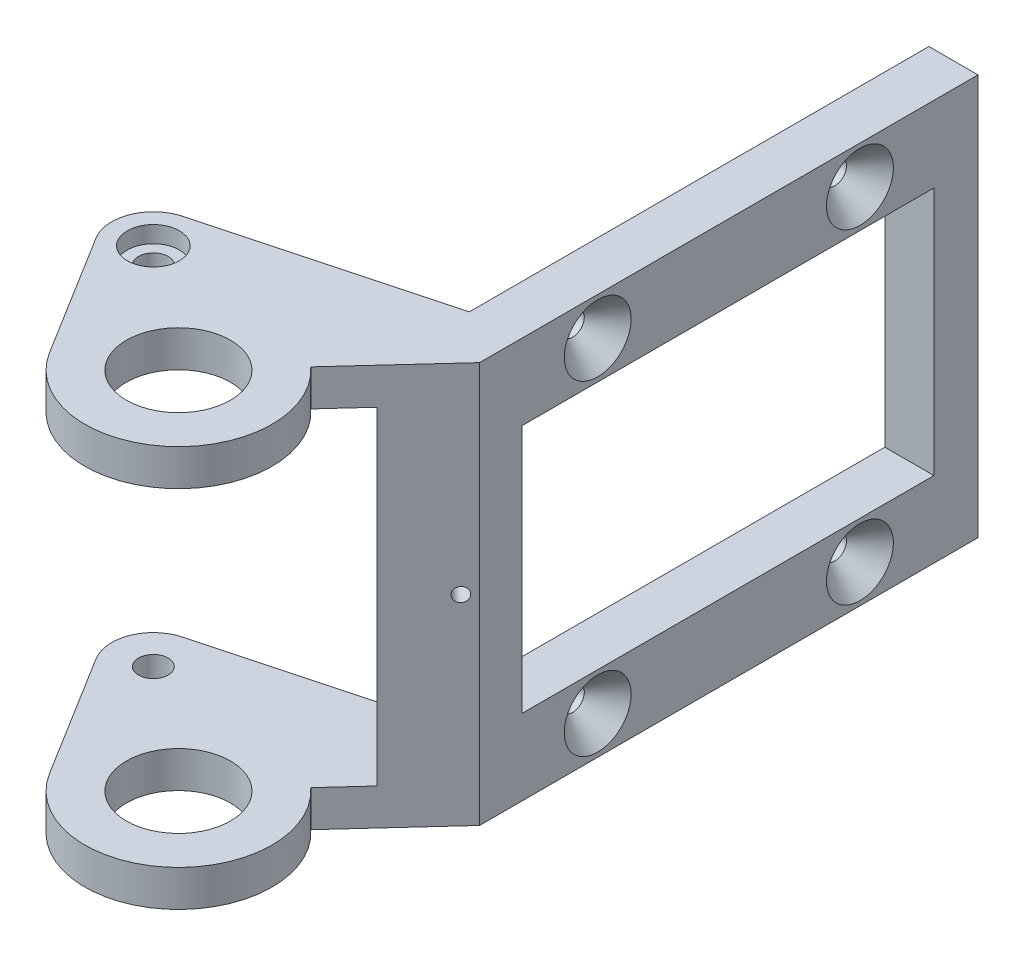
ISO-10303-21;
HEADER;
FILE_DESCRIPTION(('STEP AP214'),'2;1');
FILE_NAME('part.step','',(''),(''),'','','');
FILE_SCHEMA(('AUTOMOTIVE_DESIGN { 1 0 10303 214 1 1 1 1 }'));
ENDSEC;
DATA;
#1=APPLICATION_CONTEXT('core data for automotive mechanical design processes');
#2=APPLICATION_PROTOCOL_DEFINITION('international standard','automotive_design',2000,#1);
#3=PRODUCT_CONTEXT('',#1,'mechanical');
#4=PRODUCT('Part','Part','',(#3));
#5=PRODUCT_RELATED_PRODUCT_CATEGORY('part','',(#4));
#6=PRODUCT_DEFINITION_FORMATION('','',#4);
#7=PRODUCT_DEFINITION_CONTEXT('part definition',#1,'design');
#8=PRODUCT_DEFINITION('design','',#6,#7);
#9=PRODUCT_DEFINITION_SHAPE('','',#8);
#10=(LENGTH_UNIT() NAMED_UNIT(*) SI_UNIT(.MILLI.,.METRE.));
#11=(NAMED_UNIT(*) PLANE_ANGLE_UNIT() SI_UNIT($,.RADIAN.));
#12=(NAMED_UNIT(*) SI_UNIT($,.STERADIAN.) SOLID_ANGLE_UNIT());
#13=UNCERTAINTY_MEASURE_WITH_UNIT(LENGTH_MEASURE(1.E-05),#10,'distance_accuracy_value','');
#14=(GEOMETRIC_REPRESENTATION_CONTEXT(3) GLOBAL_UNCERTAINTY_ASSIGNED_CONTEXT((#13)) GLOBAL_UNIT_ASSIGNED_CONTEXT((#10,
#11,#12)) REPRESENTATION_CONTEXT('',''));
#15=CARTESIAN_POINT('',(0.,0.,0.));
#16=DIRECTION('',(0.,0.,1.));
#17=DIRECTION('',(1.,0.,0.));
#18=AXIS2_PLACEMENT_3D('',#15,#16,#17);
#19=CARTESIAN_POINT('',(-31.1453551016939,12.508000003,-7.26238793210637));
#20=DIRECTION('',(0.,1.,0.));
#21=DIRECTION('',(0.,0.,1.));
#22=AXIS2_PLACEMENT_3D('',#19,#20,#21);
#23=CYLINDRICAL_SURFACE('',#22,1.1303);
#24=CARTESIAN_POINT('',(-31.1453551016939,12.508000003,-7.26238793210637));
#25=DIRECTION('',(0.,-1.,0.));
#26=DIRECTION('',(0.,0.,1.));
#27=AXIS2_PLACEMENT_3D('',#24,#25,#26);
#28=CIRCLE('',#27,1.1303);
#29=CARTESIAN_POINT('',(-31.1453551016939,12.508000003,-6.13208793210637));
#30=VERTEX_POINT('',#29);
#31=EDGE_CURVE('E297',#30,#30,#28,.T.);
#32=ORIENTED_EDGE('',*,*,#31,.T.);
#33=EDGE_LOOP('',(#32));
#34=FACE_BOUND('',#33,.T.);
#35=CARTESIAN_POINT('',(-31.1453551016939,14.016125003,-7.26238793210637));
#36=DIRECTION('',(0.,-1.,0.));
#37=DIRECTION('',(0.,0.,1.));
#38=AXIS2_PLACEMENT_3D('',#35,#36,#37);
#39=CIRCLE('',#38,1.1303);
#40=CARTESIAN_POINT('',(-31.1453551016939,14.016125003,-6.13208793210637));
#41=VERTEX_POINT('',#40);
#42=EDGE_CURVE('E38',#41,#41,#39,.F.);
#43=ORIENTED_EDGE('',*,*,#42,.T.);
#44=EDGE_LOOP('',(#43));
#45=FACE_BOUND('',#44,.T.);
#46=ADVANCED_FACE('F34',(#34,#45),#23,.F.);
#47=CARTESIAN_POINT('',(-21.968,15.286125003,0.));
#48=DIRECTION('',(0.,-1.,0.));
#49=DIRECTION('',(0.,0.,-1.));
#50=AXIS2_PLACEMENT_3D('',#47,#48,#49);
#51=CYLINDRICAL_SURFACE('',#50,7.14375);
#52=DIRECTION('',(0.,-1.,0.));
#53=VECTOR('',#52,1.);
#54=CARTESIAN_POINT('',(-28.038032359184,-12.508000003,3.76667907060839));
#55=LINE('',#54,#53);
#56=CARTESIAN_POINT('',(-28.038032359184,-12.508000003,3.76667907060839));
#57=VERTEX_POINT('',#56);
#58=CARTESIAN_POINT('',(-28.038032359184,-15.286125003,3.76667907060839));
#59=VERTEX_POINT('',#58);
#60=EDGE_CURVE('E398',#57,#59,#55,.T.);
#61=ORIENTED_EDGE('',*,*,#60,.T.);
#62=CARTESIAN_POINT('',(-21.968,-15.286125003,0.));
#63=DIRECTION('',(0.,-1.,0.));
#64=DIRECTION('',(0.,0.,1.));
#65=AXIS2_PLACEMENT_3D('',#62,#63,#64);
#66=CIRCLE('',#65,7.14375);
#67=CARTESIAN_POINT('',(-17.1417524543456,-15.286125003,-5.26692497483732));
#68=VERTEX_POINT('',#67);
#69=EDGE_CURVE('E206',#68,#59,#66,.T.);
#70=ORIENTED_EDGE('',*,*,#69,.F.);
#71=DIRECTION('',(0.,-1.,0.));
#72=VECTOR('',#71,1.);
#73=CARTESIAN_POINT('',(-17.1417524543456,15.286125003,-5.26692497483732));
#74=LINE('',#73,#72);
#75=CARTESIAN_POINT('',(-17.1417524543456,-12.508000003,-5.26692497483732));
#76=VERTEX_POINT('',#75);
#77=EDGE_CURVE('E210',#76,#68,#74,.T.);
#78=ORIENTED_EDGE('',*,*,#77,.F.);
#79=CARTESIAN_POINT('',(-21.968,-12.508000003,0.));
#80=DIRECTION('',(0.,1.,0.));
#81=DIRECTION('',(-1.,0.,0.));
#82=AXIS2_PLACEMENT_3D('',#79,#80,#81);
#83=CIRCLE('',#82,7.14375);
#84=EDGE_CURVE('E229',#57,#76,#83,.T.);
#85=ORIENTED_EDGE('',*,*,#84,.F.);
#86=EDGE_LOOP('',(#61,#70,#78,#85));
#87=FACE_BOUND('',#86,.T.);
#88=ADVANCED_FACE('F429',(#87),#51,.T.);
#89=DIRECTION('',(0.,1.,0.));
#90=VECTOR('',#89,1.);
#91=CARTESIAN_POINT('',(-28.038032359184,12.508000003,3.76667907060839));
#92=LINE('',#91,#90);
#93=CARTESIAN_POINT('',(-28.038032359184,12.508000003,3.76667907060839));
#94=VERTEX_POINT('',#93);
#95=CARTESIAN_POINT('',(-28.038032359184,15.286125003,3.76667907060839));
#96=VERTEX_POINT('',#95);
#97=EDGE_CURVE('E301',#94,#96,#92,.T.);
#98=ORIENTED_EDGE('',*,*,#97,.F.);
#99=CARTESIAN_POINT('',(-21.968,12.508000003,0.));
#100=DIRECTION('',(0.,-1.,0.));
#101=DIRECTION('',(1.,0.,0.));
#102=AXIS2_PLACEMENT_3D('',#99,#100,#101);
#103=CIRCLE('',#102,7.14375);
#104=CARTESIAN_POINT('',(-17.1417524543456,12.508000003,-5.26692497483732));
#105=VERTEX_POINT('',#104);
#106=EDGE_CURVE('E223',#105,#94,#103,.T.);
#107=ORIENTED_EDGE('',*,*,#106,.F.);
#108=CARTESIAN_POINT('',(-17.1417524543456,15.286125003,-5.26692497483732));
#109=VERTEX_POINT('',#108);
#110=EDGE_CURVE('E213',#109,#105,#74,.T.);
#111=ORIENTED_EDGE('',*,*,#110,.F.);
#112=CARTESIAN_POINT('',(-21.968,15.286125003,0.));
#113=DIRECTION('',(0.,-1.,0.));
#114=DIRECTION('',(0.,0.,1.));
#115=AXIS2_PLACEMENT_3D('',#112,#113,#114);
#116=CIRCLE('',#115,7.14375);
#117=EDGE_CURVE('E207',#109,#96,#116,.T.);
#118=ORIENTED_EDGE('',*,*,#117,.T.);
#119=EDGE_LOOP('',(#98,#107,#111,#118));
#120=FACE_BOUND('',#119,.T.);
#121=ADVANCED_FACE('F413',(#120),#51,.T.);
#122=CARTESIAN_POINT('',(-40.4562897388681,0.,-37.6196073422551));
#123=DIRECTION('',(0.737277336810123,0.,0.675590207615661));
#124=DIRECTION('',(-0.675590207615662,0.,0.737277336810123));
#125=AXIS2_PLACEMENT_3D('',#122,#123,#124);
#126=CYLINDRICAL_SURFACE('',#125,0.535);
#127=CARTESIAN_POINT('',(-11.6682378679477,0.,-11.2402179737));
#128=DIRECTION('',(-0.737277336810123,0.,-0.675590207615662));
#129=DIRECTION('',(-0.675590207615662,0.,0.737277336810123));
#130=AXIS2_PLACEMENT_3D('',#127,#128,#129);
#131=CIRCLE('',#130,0.535);
#132=CARTESIAN_POINT('',(-12.0296786290221,0.,-10.8457745985066));
#133=VERTEX_POINT('',#132);
#134=EDGE_CURVE('E246',#133,#133,#131,.T.);
#135=ORIENTED_EDGE('',*,*,#134,.F.);
#136=EDGE_LOOP('',(#135));
#137=FACE_BOUND('',#136,.T.);
#138=CARTESIAN_POINT('',(-13.1427925415679,0.,-12.5913983889314));
#139=DIRECTION('',(0.737277336810123,0.,0.675590207615662));
#140=DIRECTION('',(0.675590207615662,0.,-0.737277336810123));
#141=AXIS2_PLACEMENT_3D('',#138,#139,#140);
#142=CIRCLE('',#141,0.535);
#143=CARTESIAN_POINT('',(-12.7813517804935,0.,-12.9858417641248));
#144=VERTEX_POINT('',#143);
#145=EDGE_CURVE('E239',#144,#144,#142,.F.);
#146=ORIENTED_EDGE('',*,*,#145,.T.);
#147=EDGE_LOOP('',(#146));
#148=FACE_BOUND('',#147,.T.);
#149=ADVANCED_FACE('F482',(#137,#148),#126,.F.);
#150=CARTESIAN_POINT('',(-21.968,15.286125003,0.));
#151=DIRECTION('',(-0.737277336810123,0.,-0.675590207615662));
#152=DIRECTION('',(0.675590207615662,0.,-0.737277336810123));
#153=AXIS2_PLACEMENT_3D('',#150,#151,#152);
#154=PLANE('',#153);
#155=ORIENTED_EDGE('',*,*,#134,.T.);
#156=EDGE_LOOP('',(#155));
#157=FACE_BOUND('',#156,.T.);
#158=DIRECTION('',(0.,1.,0.));
#159=VECTOR('',#158,1.);
#160=CARTESIAN_POINT('',(-10.984,15.286125003,-11.9869325757448));
#161=LINE('',#160,#159);
#162=CARTESIAN_POINT('',(-10.984,-15.286125003,-11.9869325757448));
#163=VERTEX_POINT('',#162);
#164=CARTESIAN_POINT('',(-10.984,15.286125003,-11.9869325757448));
#165=VERTEX_POINT('',#164);
#166=EDGE_CURVE('E360',#163,#165,#161,.T.);
#167=ORIENTED_EDGE('',*,*,#166,.T.);
#168=DIRECTION('',(-0.675590207615662,0.,0.737277336810123));
#169=VECTOR('',#168,1.);
#170=CARTESIAN_POINT('',(-21.968,15.286125003,0.));
#171=LINE('',#170,#169);
#172=EDGE_CURVE('E220',#165,#109,#171,.T.);
#173=ORIENTED_EDGE('',*,*,#172,.T.);
#174=ORIENTED_EDGE('',*,*,#110,.T.);
#175=DIRECTION('',(-0.675590207615662,0.,0.737277336810123));
#176=VECTOR('',#175,1.);
#177=CARTESIAN_POINT('',(-21.968,12.508000003,0.));
#178=LINE('',#177,#176);
#179=CARTESIAN_POINT('',(-14.7305,12.508000003,-7.89834527648882));
#180=VERTEX_POINT('',#179);
#181=EDGE_CURVE('E193',#180,#105,#178,.T.);
#182=ORIENTED_EDGE('',*,*,#181,.F.);
#183=DIRECTION('',(0.,1.,0.));
#184=VECTOR('',#183,1.);
#185=CARTESIAN_POINT('',(-14.7305,15.286125003,-7.89834527648882));
#186=LINE('',#185,#184);
#187=CARTESIAN_POINT('',(-14.7305,-12.508000003,-7.89834527648883));
#188=VERTEX_POINT('',#187);
#189=EDGE_CURVE('E204',#188,#180,#186,.T.);
#190=ORIENTED_EDGE('',*,*,#189,.F.);
#191=DIRECTION('',(0.675590207615662,0.,-0.737277336810123));
#192=VECTOR('',#191,1.);
#193=CARTESIAN_POINT('',(-21.968,-12.508000003,0.));
#194=LINE('',#193,#192);
#195=EDGE_CURVE('E191',#76,#188,#194,.T.);
#196=ORIENTED_EDGE('',*,*,#195,.F.);
#197=ORIENTED_EDGE('',*,*,#77,.T.);
#198=DIRECTION('',(-0.675590207615662,0.,0.737277336810123));
#199=VECTOR('',#198,1.);
#200=CARTESIAN_POINT('',(-21.968,-15.286125003,0.));
#201=LINE('',#200,#199);
#202=EDGE_CURVE('E221',#163,#68,#201,.T.);
#203=ORIENTED_EDGE('',*,*,#202,.F.);
#204=EDGE_LOOP('',(#167,#173,#174,#182,#190,#196,#197,#203));
#205=FACE_BOUND('',#204,.T.);
#206=ADVANCED_FACE('F408',(#157,#205),#154,.F.);
#207=CARTESIAN_POINT('',(-9.96800000000001,15.286125003,-50.));
#208=DIRECTION('',(0.,0.,1.));
#209=DIRECTION('',(-1.,0.,0.));
#210=AXIS2_PLACEMENT_3D('',#207,#208,#209);
#211=PLANE('',#210);
#212=DIRECTION('',(0.,-1.,0.));
#213=VECTOR('',#212,1.);
#214=CARTESIAN_POINT('',(-10.984,15.286125003,-50.));
#215=LINE('',#214,#213);
#216=CARTESIAN_POINT('',(-10.984,15.286125003,-50.));
#217=VERTEX_POINT('',#216);
#218=CARTESIAN_POINT('',(-10.984,-15.286125003,-50.));
#219=VERTEX_POINT('',#218);
#220=EDGE_CURVE('E357',#217,#219,#215,.T.);
#221=ORIENTED_EDGE('',*,*,#220,.T.);
#222=DIRECTION('',(1.,0.,0.));
#223=VECTOR('',#222,1.);
#224=CARTESIAN_POINT('',(-9.96800000000001,-15.286125003,-50.));
#225=LINE('',#224,#223);
#226=CARTESIAN_POINT('',(-14.7305,-15.286125003,-50.));
#227=VERTEX_POINT('',#226);
#228=EDGE_CURVE('E216',#227,#219,#225,.T.);
#229=ORIENTED_EDGE('',*,*,#228,.F.);
#230=DIRECTION('',(0.,1.,0.));
#231=VECTOR('',#230,1.);
#232=CARTESIAN_POINT('',(-14.7305,12.508000003,-50.));
#233=LINE('',#232,#231);
#234=CARTESIAN_POINT('',(-14.7305,15.286125003,-50.));
#235=VERTEX_POINT('',#234);
#236=EDGE_CURVE('E198',#227,#235,#233,.T.);
#237=ORIENTED_EDGE('',*,*,#236,.T.);
#238=DIRECTION('',(1.,0.,0.));
#239=VECTOR('',#238,1.);
#240=CARTESIAN_POINT('',(-9.96800000000001,15.286125003,-50.));
#241=LINE('',#240,#239);
#242=EDGE_CURVE('E217',#235,#217,#241,.T.);
#243=ORIENTED_EDGE('',*,*,#242,.T.);
#244=EDGE_LOOP('',(#221,#229,#237,#243));
#245=FACE_BOUND('',#244,.T.);
#246=ADVANCED_FACE('F376',(#245),#211,.F.);
#247=CARTESIAN_POINT('',(-21.968,15.286125003,0.));
#248=DIRECTION('',(0.,-1.,0.));
#249=DIRECTION('',(0.,0.,-1.));
#250=AXIS2_PLACEMENT_3D('',#247,#248,#249);
#251=PLANE('',#250);
#252=CARTESIAN_POINT('',(-31.1453551016939,15.286125003,-7.26238793210637));
#253=DIRECTION('',(0.,-1.,0.));
#254=DIRECTION('',(0.,0.,1.));
#255=AXIS2_PLACEMENT_3D('',#252,#253,#254);
#256=CIRCLE('',#255,1.984375);
#257=CARTESIAN_POINT('',(-31.1453551016939,15.286125003,-5.27801293210637));
#258=VERTEX_POINT('',#257);
#259=EDGE_CURVE('E464',#258,#258,#256,.T.);
#260=ORIENTED_EDGE('',*,*,#259,.T.);
#261=EDGE_LOOP('',(#260));
#262=FACE_BOUND('',#261,.T.);
#263=DIRECTION('',(-0.52726916124002,0.,-0.849698317996009));
#264=VECTOR('',#263,1.);
#265=CARTESIAN_POINT('',(-28.038032359184,15.286125003,3.76667907060839));
#266=LINE('',#265,#264);
#267=CARTESIAN_POINT('',(-33.8431472613312,15.286125003,-5.58830834516931));
#268=VERTEX_POINT('',#267);
#269=EDGE_CURVE('E292',#96,#268,#266,.T.);
#270=ORIENTED_EDGE('',*,*,#269,.F.);
#271=ORIENTED_EDGE('',*,*,#117,.F.);
#272=ORIENTED_EDGE('',*,*,#172,.F.);
#273=DIRECTION('',(0.,0.,-1.));
#274=VECTOR('',#273,1.);
#275=CARTESIAN_POINT('',(-10.984,15.286125003,0.));
#276=LINE('',#275,#274);
#277=EDGE_CURVE('E363',#165,#217,#276,.T.);
#278=ORIENTED_EDGE('',*,*,#277,.T.);
#279=ORIENTED_EDGE('',*,*,#242,.F.);
#280=DIRECTION('',(0.,0.,1.));
#281=VECTOR('',#280,1.);
#282=CARTESIAN_POINT('',(-14.7305,15.286125003,-50.));
#283=LINE('',#282,#281);
#284=CARTESIAN_POINT('',(-14.7305,15.286125003,-14.9477369732811));
#285=VERTEX_POINT('',#284);
#286=EDGE_CURVE('E289',#235,#285,#283,.T.);
#287=ORIENTED_EDGE('',*,*,#286,.T.);
#288=DIRECTION('',(0.965925826289069,0.,-0.258819045102518));
#289=VECTOR('',#288,1.);
#290=CARTESIAN_POINT('',(-14.7305,15.286125003,-14.9477369732811));
#291=LINE('',#290,#289);
#292=CARTESIAN_POINT('',(-31.9671055698944,15.286125003,-10.3292024305742));
#293=VERTEX_POINT('',#292);
#294=EDGE_CURVE('E285',#293,#285,#291,.T.);
#295=ORIENTED_EDGE('',*,*,#294,.F.);
#296=CARTESIAN_POINT('',(-31.1453551016939,15.286125003,-7.26238793210637));
#297=DIRECTION('',(0.,1.,0.));
#298=DIRECTION('',(0.,0.,-1.));
#299=AXIS2_PLACEMENT_3D('',#296,#297,#298);
#300=CIRCLE('',#299,3.175);
#301=EDGE_CURVE('E278',#268,#293,#300,.F.);
#302=ORIENTED_EDGE('',*,*,#301,.F.);
#303=EDGE_LOOP('',(#270,#271,#272,#278,#279,#287,#295,#302));
#304=FACE_BOUND('',#303,.T.);
#305=CARTESIAN_POINT('',(-21.968,15.286125003,0.));
#306=DIRECTION('',(0.,-1.,0.));
#307=DIRECTION('',(0.,0.,1.));
#308=AXIS2_PLACEMENT_3D('',#305,#306,#307);
#309=CIRCLE('',#308,3.96875);
#310=CARTESIAN_POINT('',(-21.968,15.286125003,3.96875));
#311=VERTEX_POINT('',#310);
#312=EDGE_CURVE('E185',#311,#311,#309,.T.);
#313=ORIENTED_EDGE('',*,*,#312,.T.);
#314=EDGE_LOOP('',(#313));
#315=FACE_BOUND('',#314,.T.);
#316=ADVANCED_FACE('F286',(#262,#304,#315),#251,.F.);
#317=CARTESIAN_POINT('',(-21.968,-15.286125003,0.));
#318=DIRECTION('',(0.,-1.,0.));
#319=DIRECTION('',(0.,0.,-1.));
#320=AXIS2_PLACEMENT_3D('',#317,#318,#319);
#321=PLANE('',#320);
#322=DIRECTION('',(0.965925826289069,0.,-0.258819045102518));
#323=VECTOR('',#322,1.);
#324=CARTESIAN_POINT('',(-14.7305,-15.286125003,-14.9477369732811));
#325=LINE('',#324,#323);
#326=CARTESIAN_POINT('',(-31.9671055698944,-15.286125003,-10.3292024305742));
#327=VERTEX_POINT('',#326);
#328=CARTESIAN_POINT('',(-14.7305,-15.286125003,-14.9477369732811));
#329=VERTEX_POINT('',#328);
#330=EDGE_CURVE('E388',#327,#329,#325,.T.);
#331=ORIENTED_EDGE('',*,*,#330,.T.);
#332=DIRECTION('',(0.,0.,1.));
#333=VECTOR('',#332,1.);
#334=CARTESIAN_POINT('',(-14.7305,-15.286125003,-50.));
#335=LINE('',#334,#333);
#336=EDGE_CURVE('E183',#227,#329,#335,.T.);
#337=ORIENTED_EDGE('',*,*,#336,.F.);
#338=ORIENTED_EDGE('',*,*,#228,.T.);
#339=DIRECTION('',(0.,0.,-1.));
#340=VECTOR('',#339,1.);
#341=CARTESIAN_POINT('',(-10.984,-15.286125003,0.));
#342=LINE('',#341,#340);
#343=EDGE_CURVE('E231',#163,#219,#342,.T.);
#344=ORIENTED_EDGE('',*,*,#343,.F.);
#345=ORIENTED_EDGE('',*,*,#202,.T.);
#346=ORIENTED_EDGE('',*,*,#69,.T.);
#347=DIRECTION('',(-0.52726916124002,0.,-0.849698317996009));
#348=VECTOR('',#347,1.);
#349=CARTESIAN_POINT('',(-28.038032359184,-15.286125003,3.76667907060839));
#350=LINE('',#349,#348);
#351=CARTESIAN_POINT('',(-33.8431472613312,-15.286125003,-5.58830834516931));
#352=VERTEX_POINT('',#351);
#353=EDGE_CURVE('E175',#59,#352,#350,.T.);
#354=ORIENTED_EDGE('',*,*,#353,.T.);
#355=CARTESIAN_POINT('',(-31.1453551016939,-15.286125003,-7.26238793210637));
#356=DIRECTION('',(0.,1.,0.));
#357=DIRECTION('',(0.,0.,-1.));
#358=AXIS2_PLACEMENT_3D('',#355,#356,#357);
#359=CIRCLE('',#358,3.175);
#360=EDGE_CURVE('E269',#327,#352,#359,.T.);
#361=ORIENTED_EDGE('',*,*,#360,.F.);
#362=EDGE_LOOP('',(#331,#337,#338,#344,#345,#346,#354,#361));
#363=FACE_BOUND('',#362,.T.);
#364=CARTESIAN_POINT('',(-31.1453551016939,-15.286125003,-7.26238793210637));
#365=DIRECTION('',(0.,-1.,0.));
#366=DIRECTION('',(0.,0.,1.));
#367=AXIS2_PLACEMENT_3D('',#364,#365,#366);
#368=CIRCLE('',#367,1.1303);
#369=CARTESIAN_POINT('',(-31.1453551016939,-15.286125003,-6.13208793210637));
#370=VERTEX_POINT('',#369);
#371=EDGE_CURVE('E394',#370,#370,#368,.T.);
#372=ORIENTED_EDGE('',*,*,#371,.F.);
#373=EDGE_LOOP('',(#372));
#374=FACE_BOUND('',#373,.T.);
#375=CARTESIAN_POINT('',(-21.968,-15.286125003,0.));
#376=DIRECTION('',(0.,-1.,0.));
#377=DIRECTION('',(0.,0.,1.));
#378=AXIS2_PLACEMENT_3D('',#375,#376,#377);
#379=CIRCLE('',#378,3.96875);
#380=CARTESIAN_POINT('',(-21.968,-15.286125003,3.96875));
#381=VERTEX_POINT('',#380);
#382=EDGE_CURVE('E236',#381,#381,#379,.T.);
#383=ORIENTED_EDGE('',*,*,#382,.F.);
#384=EDGE_LOOP('',(#383));
#385=FACE_BOUND('',#384,.T.);
#386=ADVANCED_FACE('F385',(#363,#374,#385),#321,.T.);
#387=CARTESIAN_POINT('',(-14.7305,12.508000003,7.14375));
#388=DIRECTION('',(1.,0.,0.));
#389=DIRECTION('',(0.,-1.,0.));
#390=AXIS2_PLACEMENT_3D('',#387,#388,#389);
#391=PLANE('',#390);
#392=CARTESIAN_POINT('',(-14.7305,12.3930625015,-40.9934662878724));
#393=DIRECTION('',(-1.,0.,0.));
#394=DIRECTION('',(0.,-1.,0.));
#395=AXIS2_PLACEMENT_3D('',#392,#393,#394);
#396=CIRCLE('',#395,0.888999999999997);
#397=CARTESIAN_POINT('',(-14.7305,11.5040625015,-40.9934662878724));
#398=VERTEX_POINT('',#397);
#399=EDGE_CURVE('E263',#398,#398,#396,.T.);
#400=ORIENTED_EDGE('',*,*,#399,.F.);
#401=EDGE_LOOP('',(#400));
#402=FACE_BOUND('',#401,.T.);
#403=CARTESIAN_POINT('',(-14.7305,12.3930625015,-20.9934662878724));
#404=DIRECTION('',(-1.,0.,0.));
#405=DIRECTION('',(0.,-1.,0.));
#406=AXIS2_PLACEMENT_3D('',#403,#404,#405);
#407=CIRCLE('',#406,0.888999999999997);
#408=CARTESIAN_POINT('',(-14.7305,11.5040625015,-20.9934662878724));
#409=VERTEX_POINT('',#408);
#410=EDGE_CURVE('E258',#409,#409,#407,.T.);
#411=ORIENTED_EDGE('',*,*,#410,.F.);
#412=EDGE_LOOP('',(#411));
#413=FACE_BOUND('',#412,.T.);
#414=CARTESIAN_POINT('',(-14.7305,-12.3930625015,-20.9934662878724));
#415=DIRECTION('',(-1.,0.,0.));
#416=DIRECTION('',(0.,-1.,0.));
#417=AXIS2_PLACEMENT_3D('',#414,#415,#416);
#418=CIRCLE('',#417,0.888999999999997);
#419=CARTESIAN_POINT('',(-14.7305,-13.2820625015,-20.9934662878724));
#420=VERTEX_POINT('',#419);
#421=EDGE_CURVE('E253',#420,#420,#418,.T.);
#422=ORIENTED_EDGE('',*,*,#421,.F.);
#423=EDGE_LOOP('',(#422));
#424=FACE_BOUND('',#423,.T.);
#425=CARTESIAN_POINT('',(-14.7305,-12.3930625015,-40.9934662878724));
#426=DIRECTION('',(-1.,0.,0.));
#427=DIRECTION('',(0.,-1.,0.));
#428=AXIS2_PLACEMENT_3D('',#425,#426,#427);
#429=CIRCLE('',#428,0.888999999999997);
#430=CARTESIAN_POINT('',(-14.7305,-13.2820625015,-40.9934662878724));
#431=VERTEX_POINT('',#430);
#432=EDGE_CURVE('E248',#431,#431,#429,.T.);
#433=ORIENTED_EDGE('',*,*,#432,.F.);
#434=EDGE_LOOP('',(#433));
#435=FACE_BOUND('',#434,.T.);
#436=DIRECTION('',(0.,0.,-1.));
#437=VECTOR('',#436,1.);
#438=CARTESIAN_POINT('',(-14.7305,-9.50000000000001,-15.2179446184681));
#439=LINE('',#438,#437);
#440=CARTESIAN_POINT('',(-14.7305,-9.50000000000001,-15.2179446184681));
#441=VERTEX_POINT('',#440);
#442=CARTESIAN_POINT('',(-14.7305,-9.50000000000001,-46.6399446184682));
#443=VERTEX_POINT('',#442);
#444=EDGE_CURVE('E325',#441,#443,#439,.T.);
#445=ORIENTED_EDGE('',*,*,#444,.T.);
#446=DIRECTION('',(0.,1.,0.));
#447=VECTOR('',#446,1.);
#448=CARTESIAN_POINT('',(-14.7305,-9.50000000000001,-46.6399446184682));
#449=LINE('',#448,#447);
#450=CARTESIAN_POINT('',(-14.7305,9.49999999999999,-46.6399446184682));
#451=VERTEX_POINT('',#450);
#452=EDGE_CURVE('E251',#443,#451,#449,.T.);
#453=ORIENTED_EDGE('',*,*,#452,.T.);
#454=DIRECTION('',(0.,0.,1.));
#455=VECTOR('',#454,1.);
#456=CARTESIAN_POINT('',(-14.7305,9.49999999999999,-15.2179446184681));
#457=LINE('',#456,#455);
#458=CARTESIAN_POINT('',(-14.7305,9.49999999999999,-15.2179446184681));
#459=VERTEX_POINT('',#458);
#460=EDGE_CURVE('E337',#451,#459,#457,.T.);
#461=ORIENTED_EDGE('',*,*,#460,.T.);
#462=DIRECTION('',(0.,-1.,0.));
#463=VECTOR('',#462,1.);
#464=CARTESIAN_POINT('',(-14.7305,-9.50000000000001,-15.2179446184681));
#465=LINE('',#464,#463);
#466=CARTESIAN_POINT('',(-14.7305,0.90346959405097,-15.2179446184681));
#467=VERTEX_POINT('',#466);
#468=EDGE_CURVE('E341',#459,#467,#465,.T.);
#469=ORIENTED_EDGE('',*,*,#468,.T.);
#470=CARTESIAN_POINT('',(-14.7305,0.,-14.0462642283127));
#471=DIRECTION('',(-1.,0.,0.));
#472=DIRECTION('',(0.,0.,1.));
#473=AXIS2_PLACEMENT_3D('',#470,#471,#472);
#474=ELLIPSE('',#473,1.69542713113657,1.25);
#475=CARTESIAN_POINT('',(-14.7305,-0.903469594050969,-15.2179446184681));
#476=VERTEX_POINT('',#475);
#477=EDGE_CURVE('E242',#467,#476,#474,.F.);
#478=ORIENTED_EDGE('',*,*,#477,.T.);
#479=EDGE_CURVE('E340',#476,#441,#465,.T.);
#480=ORIENTED_EDGE('',*,*,#479,.T.);
#481=EDGE_LOOP('',(#445,#453,#461,#469,#478,#480));
#482=FACE_BOUND('',#481,.T.);
#483=DIRECTION('',(0.,0.,-1.));
#484=VECTOR('',#483,1.);
#485=CARTESIAN_POINT('',(-14.7305,-12.508000003,7.14375));
#486=LINE('',#485,#484);
#487=CARTESIAN_POINT('',(-14.7305,-12.508000003,-14.9477369732811));
#488=VERTEX_POINT('',#487);
#489=EDGE_CURVE('E180',#188,#488,#486,.T.);
#490=ORIENTED_EDGE('',*,*,#489,.F.);
#491=ORIENTED_EDGE('',*,*,#189,.T.);
#492=DIRECTION('',(0.,0.,-1.));
#493=VECTOR('',#492,1.);
#494=CARTESIAN_POINT('',(-14.7305,12.508000003,7.14375));
#495=LINE('',#494,#493);
#496=CARTESIAN_POINT('',(-14.7305,12.508000003,-14.9477369732811));
#497=VERTEX_POINT('',#496);
#498=EDGE_CURVE('E194',#180,#497,#495,.T.);
#499=ORIENTED_EDGE('',*,*,#498,.T.);
#500=DIRECTION('',(0.,1.,0.));
#501=VECTOR('',#500,1.);
#502=CARTESIAN_POINT('',(-14.7305,-15.286125003,-14.9477369732811));
#503=LINE('',#502,#501);
#504=EDGE_CURVE('E186',#497,#285,#503,.T.);
#505=ORIENTED_EDGE('',*,*,#504,.T.);
#506=ORIENTED_EDGE('',*,*,#286,.F.);
#507=ORIENTED_EDGE('',*,*,#236,.F.);
#508=ORIENTED_EDGE('',*,*,#336,.T.);
#509=EDGE_CURVE('E167',#329,#488,#503,.T.);
#510=ORIENTED_EDGE('',*,*,#509,.T.);
#511=EDGE_LOOP('',(#490,#491,#499,#505,#506,#507,#508,#510));
#512=FACE_BOUND('',#511,.T.);
#513=ADVANCED_FACE('F178',(#402,#413,#424,#435,#482,#512),#391,.F.);
#514=CARTESIAN_POINT('',(-14.7305,-12.508000003,7.14375));
#515=DIRECTION('',(0.,-1.,0.));
#516=DIRECTION('',(-1.,0.,0.));
#517=AXIS2_PLACEMENT_3D('',#514,#515,#516);
#518=PLANE('',#517);
#519=DIRECTION('',(-0.52726916124002,0.,-0.849698317996009));
#520=VECTOR('',#519,1.);
#521=CARTESIAN_POINT('',(-28.038032359184,-12.508000003,3.76667907060839));
#522=LINE('',#521,#520);
#523=CARTESIAN_POINT('',(-33.8431472613312,-12.508000003,-5.58830834516931));
#524=VERTEX_POINT('',#523);
#525=EDGE_CURVE('E174',#57,#524,#522,.T.);
#526=ORIENTED_EDGE('',*,*,#525,.F.);
#527=ORIENTED_EDGE('',*,*,#84,.T.);
#528=ORIENTED_EDGE('',*,*,#195,.T.);
#529=ORIENTED_EDGE('',*,*,#489,.T.);
#530=DIRECTION('',(0.965925826289069,0.,-0.258819045102518));
#531=VECTOR('',#530,1.);
#532=CARTESIAN_POINT('',(-14.7305,-12.508000003,-14.9477369732811));
#533=LINE('',#532,#531);
#534=CARTESIAN_POINT('',(-31.9671055698944,-12.508000003,-10.3292024305742));
#535=VERTEX_POINT('',#534);
#536=EDGE_CURVE('E163',#535,#488,#533,.T.);
#537=ORIENTED_EDGE('',*,*,#536,.F.);
#538=CARTESIAN_POINT('',(-31.1453551016939,-12.508000003,-7.26238793210637));
#539=DIRECTION('',(0.,1.,0.));
#540=DIRECTION('',(-1.,0.,0.));
#541=AXIS2_PLACEMENT_3D('',#538,#539,#540);
#542=CIRCLE('',#541,3.175);
#543=EDGE_CURVE('E274',#524,#535,#542,.F.);
#544=ORIENTED_EDGE('',*,*,#543,.F.);
#545=EDGE_LOOP('',(#526,#527,#528,#529,#537,#544));
#546=FACE_BOUND('',#545,.T.);
#547=CARTESIAN_POINT('',(-31.1453551016939,-12.508000003,-7.26238793210637));
#548=DIRECTION('',(0.,-1.,0.));
#549=DIRECTION('',(0.,0.,1.));
#550=AXIS2_PLACEMENT_3D('',#547,#548,#549);
#551=CIRCLE('',#550,1.1303);
#552=CARTESIAN_POINT('',(-31.1453551016939,-12.508000003,-6.13208793210637));
#553=VERTEX_POINT('',#552);
#554=EDGE_CURVE('E390',#553,#553,#551,.T.);
#555=ORIENTED_EDGE('',*,*,#554,.T.);
#556=EDGE_LOOP('',(#555));
#557=FACE_BOUND('',#556,.T.);
#558=CARTESIAN_POINT('',(-21.968,-12.508000003,0.));
#559=DIRECTION('',(0.,1.,0.));
#560=DIRECTION('',(-1.,0.,0.));
#561=AXIS2_PLACEMENT_3D('',#558,#559,#560);
#562=CIRCLE('',#561,3.96875);
#563=CARTESIAN_POINT('',(-25.93675,-12.508000003,0.));
#564=VERTEX_POINT('',#563);
#565=EDGE_CURVE('E235',#564,#564,#562,.T.);
#566=ORIENTED_EDGE('',*,*,#565,.F.);
#567=EDGE_LOOP('',(#566));
#568=FACE_BOUND('',#567,.T.);
#569=ADVANCED_FACE('F188',(#546,#557,#568),#518,.F.);
#570=CARTESIAN_POINT('',(-14.7305,12.508000003,7.14375));
#571=DIRECTION('',(0.,1.,0.));
#572=DIRECTION('',(1.,0.,0.));
#573=AXIS2_PLACEMENT_3D('',#570,#571,#572);
#574=PLANE('',#573);
#575=CARTESIAN_POINT('',(-21.968,12.508000003,0.));
#576=DIRECTION('',(0.,-1.,0.));
#577=DIRECTION('',(1.,0.,0.));
#578=AXIS2_PLACEMENT_3D('',#575,#576,#577);
#579=CIRCLE('',#578,3.96875);
#580=CARTESIAN_POINT('',(-17.99925,12.508000003,0.));
#581=VERTEX_POINT('',#580);
#582=EDGE_CURVE('E232',#581,#581,#579,.T.);
#583=ORIENTED_EDGE('',*,*,#582,.F.);
#584=EDGE_LOOP('',(#583));
#585=FACE_BOUND('',#584,.T.);
#586=DIRECTION('',(0.965925826289069,0.,-0.258819045102518));
#587=VECTOR('',#586,1.);
#588=CARTESIAN_POINT('',(-14.7305,12.508000003,-14.9477369732811));
#589=LINE('',#588,#587);
#590=CARTESIAN_POINT('',(-31.9671055698944,12.508000003,-10.3292024305742));
#591=VERTEX_POINT('',#590);
#592=EDGE_CURVE('E295',#591,#497,#589,.T.);
#593=ORIENTED_EDGE('',*,*,#592,.T.);
#594=ORIENTED_EDGE('',*,*,#498,.F.);
#595=ORIENTED_EDGE('',*,*,#181,.T.);
#596=ORIENTED_EDGE('',*,*,#106,.T.);
#597=DIRECTION('',(-0.52726916124002,0.,-0.849698317996009));
#598=VECTOR('',#597,1.);
#599=CARTESIAN_POINT('',(-28.038032359184,12.508000003,3.76667907060839));
#600=LINE('',#599,#598);
#601=CARTESIAN_POINT('',(-33.8431472613312,12.508000003,-5.58830834516931));
#602=VERTEX_POINT('',#601);
#603=EDGE_CURVE('E291',#94,#602,#600,.T.);
#604=ORIENTED_EDGE('',*,*,#603,.T.);
#605=CARTESIAN_POINT('',(-31.1453551016939,12.508000003,-7.26238793210637));
#606=DIRECTION('',(0.,-1.,0.));
#607=DIRECTION('',(1.,0.,0.));
#608=AXIS2_PLACEMENT_3D('',#605,#606,#607);
#609=CIRCLE('',#608,3.175);
#610=EDGE_CURVE('E11',#591,#602,#609,.F.);
#611=ORIENTED_EDGE('',*,*,#610,.F.);
#612=EDGE_LOOP('',(#593,#594,#595,#596,#604,#611));
#613=FACE_BOUND('',#612,.T.);
#614=ORIENTED_EDGE('',*,*,#31,.F.);
#615=EDGE_LOOP('',(#614));
#616=FACE_BOUND('',#615,.T.);
#617=ADVANCED_FACE('F403',(#585,#613,#616),#574,.F.);
#618=CARTESIAN_POINT('',(-21.968,-15.286125003,0.));
#619=DIRECTION('',(0.,1.,0.));
#620=DIRECTION('',(0.,0.,1.));
#621=AXIS2_PLACEMENT_3D('',#618,#619,#620);
#622=CYLINDRICAL_SURFACE('',#621,3.96875);
#623=ORIENTED_EDGE('',*,*,#312,.F.);
#624=EDGE_LOOP('',(#623));
#625=FACE_BOUND('',#624,.T.);
#626=ORIENTED_EDGE('',*,*,#582,.T.);
#627=EDGE_LOOP('',(#626));
#628=FACE_BOUND('',#627,.T.);
#629=ADVANCED_FACE('F600',(#625,#628),#622,.F.);
#630=ORIENTED_EDGE('',*,*,#382,.T.);
#631=EDGE_LOOP('',(#630));
#632=FACE_BOUND('',#631,.T.);
#633=ORIENTED_EDGE('',*,*,#565,.T.);
#634=EDGE_LOOP('',(#633));
#635=FACE_BOUND('',#634,.T.);
#636=ADVANCED_FACE('F609',(#632,#635),#622,.F.);
#637=CARTESIAN_POINT('',(-10.984,0.,0.));
#638=DIRECTION('',(1.,0.,0.));
#639=DIRECTION('',(0.,0.,1.));
#640=AXIS2_PLACEMENT_3D('',#637,#638,#639);
#641=PLANE('',#640);
#642=CARTESIAN_POINT('',(-10.984,12.3930625015,-40.9934662878724));
#643=DIRECTION('',(-1.,0.,0.));
#644=DIRECTION('',(0.,0.,1.));
#645=AXIS2_PLACEMENT_3D('',#642,#643,#644);
#646=CIRCLE('',#645,2.55);
#647=CARTESIAN_POINT('',(-10.984,12.3930625015,-38.4434662878724));
#648=VERTEX_POINT('',#647);
#649=EDGE_CURVE('E304',#648,#648,#646,.T.);
#650=ORIENTED_EDGE('',*,*,#649,.T.);
#651=EDGE_LOOP('',(#650));
#652=FACE_BOUND('',#651,.T.);
#653=CARTESIAN_POINT('',(-10.984,12.3930625015,-20.9934662878724));
#654=DIRECTION('',(-1.,0.,0.));
#655=DIRECTION('',(0.,0.,1.));
#656=AXIS2_PLACEMENT_3D('',#653,#654,#655);
#657=CIRCLE('',#656,2.55);
#658=CARTESIAN_POINT('',(-10.984,12.3930625015,-18.4434662878724));
#659=VERTEX_POINT('',#658);
#660=EDGE_CURVE('E266',#659,#659,#657,.T.);
#661=ORIENTED_EDGE('',*,*,#660,.T.);
#662=EDGE_LOOP('',(#661));
#663=FACE_BOUND('',#662,.T.);
#664=CARTESIAN_POINT('',(-10.984,-12.3930625015,-20.9934662878724));
#665=DIRECTION('',(-1.,0.,0.));
#666=DIRECTION('',(0.,0.,1.));
#667=AXIS2_PLACEMENT_3D('',#664,#665,#666);
#668=CIRCLE('',#667,2.55);
#669=CARTESIAN_POINT('',(-10.984,-12.3930625015,-18.4434662878724));
#670=VERTEX_POINT('',#669);
#671=EDGE_CURVE('E261',#670,#670,#668,.T.);
#672=ORIENTED_EDGE('',*,*,#671,.T.);
#673=EDGE_LOOP('',(#672));
#674=FACE_BOUND('',#673,.T.);
#675=CARTESIAN_POINT('',(-10.984,-12.3930625015,-40.9934662878724));
#676=DIRECTION('',(-1.,0.,0.));
#677=DIRECTION('',(0.,0.,1.));
#678=AXIS2_PLACEMENT_3D('',#675,#676,#677);
#679=CIRCLE('',#678,2.55);
#680=CARTESIAN_POINT('',(-10.984,-12.3930625015,-38.4434662878724));
#681=VERTEX_POINT('',#680);
#682=EDGE_CURVE('E256',#681,#681,#679,.T.);
#683=ORIENTED_EDGE('',*,*,#682,.T.);
#684=EDGE_LOOP('',(#683));
#685=FACE_BOUND('',#684,.T.);
#686=DIRECTION('',(0.,1.,0.));
#687=VECTOR('',#686,1.);
#688=CARTESIAN_POINT('',(-10.984,-9.50000000000001,-46.6399446184682));
#689=LINE('',#688,#687);
#690=CARTESIAN_POINT('',(-10.984,-9.50000000000001,-46.6399446184682));
#691=VERTEX_POINT('',#690);
#692=CARTESIAN_POINT('',(-10.984,9.49999999999999,-46.6399446184682));
#693=VERTEX_POINT('',#692);
#694=EDGE_CURVE('E321',#691,#693,#689,.T.);
#695=ORIENTED_EDGE('',*,*,#694,.F.);
#696=DIRECTION('',(0.,0.,-1.));
#697=VECTOR('',#696,1.);
#698=CARTESIAN_POINT('',(-10.984,-9.50000000000001,-15.2179446184681));
#699=LINE('',#698,#697);
#700=CARTESIAN_POINT('',(-10.984,-9.50000000000001,-15.2179446184681));
#701=VERTEX_POINT('',#700);
#702=EDGE_CURVE('E331',#701,#691,#699,.T.);
#703=ORIENTED_EDGE('',*,*,#702,.F.);
#704=DIRECTION('',(0.,-1.,0.));
#705=VECTOR('',#704,1.);
#706=CARTESIAN_POINT('',(-10.984,-9.50000000000001,-15.2179446184681));
#707=LINE('',#706,#705);
#708=CARTESIAN_POINT('',(-10.984,9.49999999999999,-15.2179446184681));
#709=VERTEX_POINT('',#708);
#710=EDGE_CURVE('E328',#709,#701,#707,.T.);
#711=ORIENTED_EDGE('',*,*,#710,.F.);
#712=DIRECTION('',(0.,0.,1.));
#713=VECTOR('',#712,1.);
#714=CARTESIAN_POINT('',(-10.984,9.49999999999999,-15.2179446184681));
#715=LINE('',#714,#713);
#716=EDGE_CURVE('E324',#693,#709,#715,.T.);
#717=ORIENTED_EDGE('',*,*,#716,.F.);
#718=EDGE_LOOP('',(#695,#703,#711,#717));
#719=FACE_BOUND('',#718,.T.);
#720=ORIENTED_EDGE('',*,*,#277,.F.);
#721=ORIENTED_EDGE('',*,*,#166,.F.);
#722=ORIENTED_EDGE('',*,*,#343,.T.);
#723=ORIENTED_EDGE('',*,*,#220,.F.);
#724=EDGE_LOOP('',(#720,#721,#722,#723));
#725=FACE_BOUND('',#724,.T.);
#726=ADVANCED_FACE('F382',(#652,#663,#674,#685,#719,#725),#641,.T.);
#727=CARTESIAN_POINT('',(-40.4562897388681,0.,-37.6196073422551));
#728=DIRECTION('',(0.737277336810123,0.,0.675590207615661));
#729=DIRECTION('',(-0.675590207615662,0.,0.737277336810123));
#730=AXIS2_PLACEMENT_3D('',#727,#728,#729);
#731=CYLINDRICAL_SURFACE('',#730,1.25);
#732=CARTESIAN_POINT('',(-16.0091647703128,0.,-15.2179446184681));
#733=DIRECTION('',(0.,0.,-1.));
#734=DIRECTION('',(1.,0.,0.));
#735=AXIS2_PLACEMENT_3D('',#732,#733,#734);
#736=ELLIPSE('',#735,1.85023404115282,1.25);
#737=EDGE_CURVE('E238',#467,#476,#736,.T.);
#738=ORIENTED_EDGE('',*,*,#737,.T.);
#739=ORIENTED_EDGE('',*,*,#477,.F.);
#740=EDGE_LOOP('',(#738,#739));
#741=FACE_BOUND('',#740,.T.);
#742=CARTESIAN_POINT('',(-13.1427925415679,0.,-12.5913983889314));
#743=DIRECTION('',(0.737277336810123,0.,0.675590207615662));
#744=DIRECTION('',(0.675590207615662,0.,-0.737277336810123));
#745=AXIS2_PLACEMENT_3D('',#742,#743,#744);
#746=CIRCLE('',#745,1.25);
#747=CARTESIAN_POINT('',(-12.2983047820483,0.,-13.512995059944));
#748=VERTEX_POINT('',#747);
#749=EDGE_CURVE('E243',#748,#748,#746,.T.);
#750=ORIENTED_EDGE('',*,*,#749,.T.);
#751=EDGE_LOOP('',(#750));
#752=FACE_BOUND('',#751,.T.);
#753=ADVANCED_FACE('F626',(#741,#752),#731,.F.);
#754=CARTESIAN_POINT('',(-13.1427925415679,0.,-12.5913983889314));
#755=DIRECTION('',(-0.737277336810123,0.,-0.675590207615662));
#756=DIRECTION('',(0.675590207615662,0.,-0.737277336810123));
#757=AXIS2_PLACEMENT_3D('',#754,#755,#756);
#758=PLANE('',#757);
#759=ORIENTED_EDGE('',*,*,#749,.F.);
#760=EDGE_LOOP('',(#759));
#761=FACE_BOUND('',#760,.T.);
#762=ORIENTED_EDGE('',*,*,#145,.F.);
#763=EDGE_LOOP('',(#762));
#764=FACE_BOUND('',#763,.T.);
#765=ADVANCED_FACE('F635',(#761,#764),#758,.T.);
#766=CARTESIAN_POINT('',(-10.984,-9.50000000000001,-46.6399446184682));
#767=DIRECTION('',(0.,0.,-1.));
#768=DIRECTION('',(1.,0.,0.));
#769=AXIS2_PLACEMENT_3D('',#766,#767,#768);
#770=PLANE('',#769);
#771=ORIENTED_EDGE('',*,*,#452,.F.);
#772=DIRECTION('',(-1.,0.,0.));
#773=VECTOR('',#772,1.);
#774=CARTESIAN_POINT('',(-10.984,-9.50000000000001,-46.6399446184682));
#775=LINE('',#774,#773);
#776=EDGE_CURVE('E346',#691,#443,#775,.T.);
#777=ORIENTED_EDGE('',*,*,#776,.F.);
#778=ORIENTED_EDGE('',*,*,#694,.T.);
#779=DIRECTION('',(-1.,0.,0.));
#780=VECTOR('',#779,1.);
#781=CARTESIAN_POINT('',(-10.984,9.49999999999999,-46.6399446184682));
#782=LINE('',#781,#780);
#783=EDGE_CURVE('E334',#693,#451,#782,.T.);
#784=ORIENTED_EDGE('',*,*,#783,.T.);
#785=EDGE_LOOP('',(#771,#777,#778,#784));
#786=FACE_BOUND('',#785,.T.);
#787=ADVANCED_FACE('F645',(#786),#770,.F.);
#788=CARTESIAN_POINT('',(-10.984,-9.50000000000001,-15.2179446184681));
#789=DIRECTION('',(0.,-1.,0.));
#790=DIRECTION('',(-1.,0.,0.));
#791=AXIS2_PLACEMENT_3D('',#788,#789,#790);
#792=PLANE('',#791);
#793=ORIENTED_EDGE('',*,*,#444,.F.);
#794=DIRECTION('',(-1.,0.,0.));
#795=VECTOR('',#794,1.);
#796=CARTESIAN_POINT('',(-10.984,-9.50000000000001,-15.2179446184681));
#797=LINE('',#796,#795);
#798=EDGE_CURVE('E348',#701,#441,#797,.T.);
#799=ORIENTED_EDGE('',*,*,#798,.F.);
#800=ORIENTED_EDGE('',*,*,#702,.T.);
#801=ORIENTED_EDGE('',*,*,#776,.T.);
#802=EDGE_LOOP('',(#793,#799,#800,#801));
#803=FACE_BOUND('',#802,.T.);
#804=ADVANCED_FACE('F655',(#803),#792,.F.);
#805=CARTESIAN_POINT('',(-10.984,-9.50000000000001,-15.2179446184681));
#806=DIRECTION('',(0.,0.,1.));
#807=DIRECTION('',(-1.,0.,0.));
#808=AXIS2_PLACEMENT_3D('',#805,#806,#807);
#809=PLANE('',#808);
#810=ORIENTED_EDGE('',*,*,#737,.F.);
#811=ORIENTED_EDGE('',*,*,#468,.F.);
#812=DIRECTION('',(-1.,0.,0.));
#813=VECTOR('',#812,1.);
#814=CARTESIAN_POINT('',(-10.984,9.49999999999999,-15.2179446184681));
#815=LINE('',#814,#813);
#816=EDGE_CURVE('E350',#709,#459,#815,.T.);
#817=ORIENTED_EDGE('',*,*,#816,.F.);
#818=ORIENTED_EDGE('',*,*,#710,.T.);
#819=ORIENTED_EDGE('',*,*,#798,.T.);
#820=ORIENTED_EDGE('',*,*,#479,.F.);
#821=EDGE_LOOP('',(#810,#811,#817,#818,#819,#820));
#822=FACE_BOUND('',#821,.T.);
#823=ADVANCED_FACE('F666',(#822),#809,.F.);
#824=CARTESIAN_POINT('',(-10.984,9.49999999999999,-15.2179446184681));
#825=DIRECTION('',(0.,1.,0.));
#826=DIRECTION('',(1.,0.,0.));
#827=AXIS2_PLACEMENT_3D('',#824,#825,#826);
#828=PLANE('',#827);
#829=ORIENTED_EDGE('',*,*,#460,.F.);
#830=ORIENTED_EDGE('',*,*,#783,.F.);
#831=ORIENTED_EDGE('',*,*,#716,.T.);
#832=ORIENTED_EDGE('',*,*,#816,.T.);
#833=EDGE_LOOP('',(#829,#830,#831,#832));
#834=FACE_BOUND('',#833,.T.);
#835=ADVANCED_FACE('F677',(#834),#828,.F.);
#836=CARTESIAN_POINT('',(-10.984,-12.3930625015,-40.9934662878724));
#837=DIRECTION('',(1.,0.,0.));
#838=DIRECTION('',(0.,0.,1.));
#839=AXIS2_PLACEMENT_3D('',#836,#837,#838);
#840=CYLINDRICAL_SURFACE('',#839,0.888999999999997);
#841=CARTESIAN_POINT('',(-12.8947619243941,-12.3930625015,-40.9934662878724));
#842=DIRECTION('',(-1.,0.,0.));
#843=DIRECTION('',(0.,0.,1.));
#844=AXIS2_PLACEMENT_3D('',#841,#842,#843);
#845=CIRCLE('',#844,0.888999999999997);
#846=CARTESIAN_POINT('',(-12.8947619243941,-12.3930625015,-40.1044662878724));
#847=VERTEX_POINT('',#846);
#848=EDGE_CURVE('E252',#847,#847,#845,.T.);
#849=ORIENTED_EDGE('',*,*,#848,.F.);
#850=EDGE_LOOP('',(#849));
#851=FACE_BOUND('',#850,.T.);
#852=ORIENTED_EDGE('',*,*,#432,.T.);
#853=EDGE_LOOP('',(#852));
#854=FACE_BOUND('',#853,.T.);
#855=ADVANCED_FACE('F686',(#851,#854),#840,.F.);
#856=CARTESIAN_POINT('',(-10.984,-12.3930625015,-40.9934662878724));
#857=DIRECTION('',(1.,0.,0.));
#858=DIRECTION('',(0.,0.,1.));
#859=AXIS2_PLACEMENT_3D('',#856,#857,#858);
#860=CONICAL_SURFACE('',#859,2.55,0.715584993317676);
#861=ORIENTED_EDGE('',*,*,#848,.T.);
#862=EDGE_LOOP('',(#861));
#863=FACE_BOUND('',#862,.T.);
#864=ORIENTED_EDGE('',*,*,#682,.F.);
#865=EDGE_LOOP('',(#864));
#866=FACE_BOUND('',#865,.T.);
#867=ADVANCED_FACE('F696',(#863,#866),#860,.F.);
#868=CARTESIAN_POINT('',(-10.984,-12.3930625015,-20.9934662878724));
#869=DIRECTION('',(1.,0.,0.));
#870=DIRECTION('',(0.,0.,1.));
#871=AXIS2_PLACEMENT_3D('',#868,#869,#870);
#872=CYLINDRICAL_SURFACE('',#871,0.888999999999997);
#873=CARTESIAN_POINT('',(-12.8947619243941,-12.3930625015,-20.9934662878724));
#874=DIRECTION('',(-1.,0.,0.));
#875=DIRECTION('',(0.,0.,1.));
#876=AXIS2_PLACEMENT_3D('',#873,#874,#875);
#877=CIRCLE('',#876,0.888999999999997);
#878=CARTESIAN_POINT('',(-12.8947619243941,-12.3930625015,-20.1044662878724));
#879=VERTEX_POINT('',#878);
#880=EDGE_CURVE('E257',#879,#879,#877,.T.);
#881=ORIENTED_EDGE('',*,*,#880,.F.);
#882=EDGE_LOOP('',(#881));
#883=FACE_BOUND('',#882,.T.);
#884=ORIENTED_EDGE('',*,*,#421,.T.);
#885=EDGE_LOOP('',(#884));
#886=FACE_BOUND('',#885,.T.);
#887=ADVANCED_FACE('F707',(#883,#886),#872,.F.);
#888=CARTESIAN_POINT('',(-10.984,-12.3930625015,-20.9934662878724));
#889=DIRECTION('',(1.,0.,0.));
#890=DIRECTION('',(0.,0.,1.));
#891=AXIS2_PLACEMENT_3D('',#888,#889,#890);
#892=CONICAL_SURFACE('',#891,2.55,0.715584993317676);
#893=ORIENTED_EDGE('',*,*,#880,.T.);
#894=EDGE_LOOP('',(#893));
#895=FACE_BOUND('',#894,.T.);
#896=ORIENTED_EDGE('',*,*,#671,.F.);
#897=EDGE_LOOP('',(#896));
#898=FACE_BOUND('',#897,.T.);
#899=ADVANCED_FACE('F717',(#895,#898),#892,.F.);
#900=CARTESIAN_POINT('',(-10.984,12.3930625015,-20.9934662878724));
#901=DIRECTION('',(1.,0.,0.));
#902=DIRECTION('',(0.,0.,1.));
#903=AXIS2_PLACEMENT_3D('',#900,#901,#902);
#904=CYLINDRICAL_SURFACE('',#903,0.888999999999997);
#905=CARTESIAN_POINT('',(-12.8947619243941,12.3930625015,-20.9934662878724));
#906=DIRECTION('',(-1.,0.,0.));
#907=DIRECTION('',(0.,0.,1.));
#908=AXIS2_PLACEMENT_3D('',#905,#906,#907);
#909=CIRCLE('',#908,0.888999999999997);
#910=CARTESIAN_POINT('',(-12.8947619243941,12.3930625015,-20.1044662878724));
#911=VERTEX_POINT('',#910);
#912=EDGE_CURVE('E262',#911,#911,#909,.T.);
#913=ORIENTED_EDGE('',*,*,#912,.F.);
#914=EDGE_LOOP('',(#913));
#915=FACE_BOUND('',#914,.T.);
#916=ORIENTED_EDGE('',*,*,#410,.T.);
#917=EDGE_LOOP('',(#916));
#918=FACE_BOUND('',#917,.T.);
#919=ADVANCED_FACE('F728',(#915,#918),#904,.F.);
#920=CARTESIAN_POINT('',(-10.984,12.3930625015,-20.9934662878724));
#921=DIRECTION('',(1.,0.,0.));
#922=DIRECTION('',(0.,0.,1.));
#923=AXIS2_PLACEMENT_3D('',#920,#921,#922);
#924=CONICAL_SURFACE('',#923,2.55,0.715584993317676);
#925=ORIENTED_EDGE('',*,*,#912,.T.);
#926=EDGE_LOOP('',(#925));
#927=FACE_BOUND('',#926,.T.);
#928=ORIENTED_EDGE('',*,*,#660,.F.);
#929=EDGE_LOOP('',(#928));
#930=FACE_BOUND('',#929,.T.);
#931=ADVANCED_FACE('F738',(#927,#930),#924,.F.);
#932=CARTESIAN_POINT('',(-10.984,12.3930625015,-40.9934662878724));
#933=DIRECTION('',(1.,0.,0.));
#934=DIRECTION('',(0.,0.,1.));
#935=AXIS2_PLACEMENT_3D('',#932,#933,#934);
#936=CYLINDRICAL_SURFACE('',#935,0.888999999999997);
#937=CARTESIAN_POINT('',(-12.8947619243941,12.3930625015,-40.9934662878724));
#938=DIRECTION('',(-1.,0.,0.));
#939=DIRECTION('',(0.,0.,1.));
#940=AXIS2_PLACEMENT_3D('',#937,#938,#939);
#941=CIRCLE('',#940,0.888999999999997);
#942=CARTESIAN_POINT('',(-12.8947619243941,12.3930625015,-40.1044662878724));
#943=VERTEX_POINT('',#942);
#944=EDGE_CURVE('E267',#943,#943,#941,.T.);
#945=ORIENTED_EDGE('',*,*,#944,.F.);
#946=EDGE_LOOP('',(#945));
#947=FACE_BOUND('',#946,.T.);
#948=ORIENTED_EDGE('',*,*,#399,.T.);
#949=EDGE_LOOP('',(#948));
#950=FACE_BOUND('',#949,.T.);
#951=ADVANCED_FACE('F749',(#947,#950),#936,.F.);
#952=CARTESIAN_POINT('',(-10.984,12.3930625015,-40.9934662878724));
#953=DIRECTION('',(1.,0.,0.));
#954=DIRECTION('',(0.,0.,1.));
#955=AXIS2_PLACEMENT_3D('',#952,#953,#954);
#956=CONICAL_SURFACE('',#955,2.55,0.715584993317676);
#957=ORIENTED_EDGE('',*,*,#944,.T.);
#958=EDGE_LOOP('',(#957));
#959=FACE_BOUND('',#958,.T.);
#960=ORIENTED_EDGE('',*,*,#649,.F.);
#961=EDGE_LOOP('',(#960));
#962=FACE_BOUND('',#961,.T.);
#963=ADVANCED_FACE('F425',(#959,#962),#956,.F.);
#964=CARTESIAN_POINT('',(-14.7305,12.508000003,-14.9477369732811));
#965=DIRECTION('',(-0.258819045102518,0.,-0.965925826289069));
#966=DIRECTION('',(0.965925826289069,0.,-0.258819045102518));
#967=AXIS2_PLACEMENT_3D('',#964,#965,#966);
#968=PLANE('',#967);
#969=ORIENTED_EDGE('',*,*,#294,.T.);
#970=ORIENTED_EDGE('',*,*,#504,.F.);
#971=ORIENTED_EDGE('',*,*,#592,.F.);
#972=DIRECTION('',(0.,1.,0.));
#973=VECTOR('',#972,1.);
#974=CARTESIAN_POINT('',(-31.9671055698944,12.508000003,-10.3292024305742));
#975=LINE('',#974,#973);
#976=EDGE_CURVE('E43',#293,#591,#975,.F.);
#977=ORIENTED_EDGE('',*,*,#976,.F.);
#978=EDGE_LOOP('',(#969,#970,#971,#977));
#979=FACE_BOUND('',#978,.T.);
#980=ADVANCED_FACE('F405',(#979),#968,.T.);
#981=CARTESIAN_POINT('',(-28.038032359184,12.508000003,3.76667907060839));
#982=DIRECTION('',(-0.849698317996008,0.,0.52726916124002));
#983=DIRECTION('',(-0.52726916124002,0.,-0.849698317996009));
#984=AXIS2_PLACEMENT_3D('',#981,#982,#983);
#985=PLANE('',#984);
#986=ORIENTED_EDGE('',*,*,#603,.F.);
#987=ORIENTED_EDGE('',*,*,#97,.T.);
#988=ORIENTED_EDGE('',*,*,#269,.T.);
#989=DIRECTION('',(0.,1.,0.));
#990=VECTOR('',#989,1.);
#991=CARTESIAN_POINT('',(-33.8431472613312,12.508000003,-5.58830834516931));
#992=LINE('',#991,#990);
#993=EDGE_CURVE('E276',#602,#268,#992,.T.);
#994=ORIENTED_EDGE('',*,*,#993,.F.);
#995=EDGE_LOOP('',(#986,#987,#988,#994));
#996=FACE_BOUND('',#995,.T.);
#997=ADVANCED_FACE('F415',(#996),#985,.T.);
#998=CARTESIAN_POINT('',(-28.038032359184,-12.508000003,3.76667907060839));
#999=DIRECTION('',(0.849698317996008,0.,-0.52726916124002));
#1000=DIRECTION('',(0.52726916124002,0.,0.849698317996009));
#1001=AXIS2_PLACEMENT_3D('',#998,#999,#1000);
#1002=PLANE('',#1001);
#1003=ORIENTED_EDGE('',*,*,#353,.F.);
#1004=ORIENTED_EDGE('',*,*,#60,.F.);
#1005=ORIENTED_EDGE('',*,*,#525,.T.);
#1006=DIRECTION('',(0.,-1.,0.));
#1007=VECTOR('',#1006,1.);
#1008=CARTESIAN_POINT('',(-33.8431472613312,-12.508000003,-5.58830834516931));
#1009=LINE('',#1008,#1007);
#1010=EDGE_CURVE('E272',#352,#524,#1009,.F.);
#1011=ORIENTED_EDGE('',*,*,#1010,.F.);
#1012=EDGE_LOOP('',(#1003,#1004,#1005,#1011));
#1013=FACE_BOUND('',#1012,.T.);
#1014=ADVANCED_FACE('F417',(#1013),#1002,.F.);
#1015=CARTESIAN_POINT('',(-14.7305,-12.508000003,-14.9477369732811));
#1016=DIRECTION('',(0.258819045102518,0.,0.965925826289069));
#1017=DIRECTION('',(-0.965925826289069,0.,0.258819045102518));
#1018=AXIS2_PLACEMENT_3D('',#1015,#1016,#1017);
#1019=PLANE('',#1018);
#1020=ORIENTED_EDGE('',*,*,#536,.T.);
#1021=ORIENTED_EDGE('',*,*,#509,.F.);
#1022=ORIENTED_EDGE('',*,*,#330,.F.);
#1023=DIRECTION('',(0.,-1.,0.));
#1024=VECTOR('',#1023,1.);
#1025=CARTESIAN_POINT('',(-31.9671055698944,-12.508000003,-10.3292024305742));
#1026=LINE('',#1025,#1024);
#1027=EDGE_CURVE('E169',#535,#327,#1026,.T.);
#1028=ORIENTED_EDGE('',*,*,#1027,.F.);
#1029=EDGE_LOOP('',(#1020,#1021,#1022,#1028));
#1030=FACE_BOUND('',#1029,.T.);
#1031=ADVANCED_FACE('F165',(#1030),#1019,.F.);
#1032=CARTESIAN_POINT('',(-31.1453551016939,-12.508000003,-7.26238793210637));
#1033=DIRECTION('',(0.,-1.,0.));
#1034=DIRECTION('',(0.,0.,-1.));
#1035=AXIS2_PLACEMENT_3D('',#1032,#1033,#1034);
#1036=CYLINDRICAL_SURFACE('',#1035,1.1303);
#1037=ORIENTED_EDGE('',*,*,#554,.F.);
#1038=EDGE_LOOP('',(#1037));
#1039=FACE_BOUND('',#1038,.T.);
#1040=ORIENTED_EDGE('',*,*,#371,.T.);
#1041=EDGE_LOOP('',(#1040));
#1042=FACE_BOUND('',#1041,.T.);
#1043=ADVANCED_FACE('F440',(#1039,#1042),#1036,.F.);
#1044=CARTESIAN_POINT('',(-31.1453551016939,-12.508000003,-7.26238793210637));
#1045=DIRECTION('',(0.,-1.,0.));
#1046=DIRECTION('',(0.,0.,-1.));
#1047=AXIS2_PLACEMENT_3D('',#1044,#1045,#1046);
#1048=CYLINDRICAL_SURFACE('',#1047,3.175);
#1049=ORIENTED_EDGE('',*,*,#543,.T.);
#1050=ORIENTED_EDGE('',*,*,#1027,.T.);
#1051=ORIENTED_EDGE('',*,*,#360,.T.);
#1052=ORIENTED_EDGE('',*,*,#1010,.T.);
#1053=EDGE_LOOP('',(#1049,#1050,#1051,#1052));
#1054=FACE_BOUND('',#1053,.T.);
#1055=ADVANCED_FACE('F444',(#1054),#1048,.T.);
#1056=CARTESIAN_POINT('',(-31.1453551016939,12.508000003,-7.26238793210637));
#1057=DIRECTION('',(0.,1.,0.));
#1058=DIRECTION('',(0.,0.,1.));
#1059=AXIS2_PLACEMENT_3D('',#1056,#1057,#1058);
#1060=CYLINDRICAL_SURFACE('',#1059,3.175);
#1061=ORIENTED_EDGE('',*,*,#610,.T.);
#1062=ORIENTED_EDGE('',*,*,#993,.T.);
#1063=ORIENTED_EDGE('',*,*,#301,.T.);
#1064=ORIENTED_EDGE('',*,*,#976,.T.);
#1065=EDGE_LOOP('',(#1061,#1062,#1063,#1064));
#1066=FACE_BOUND('',#1065,.T.);
#1067=ADVANCED_FACE('F36',(#1066),#1060,.T.);
#1068=CARTESIAN_POINT('',(-31.1453551016939,14.016125003,-7.26238793210637));
#1069=DIRECTION('',(0.,1.,0.));
#1070=DIRECTION('',(0.,0.,1.));
#1071=AXIS2_PLACEMENT_3D('',#1068,#1069,#1070);
#1072=PLANE('',#1071);
#1073=CARTESIAN_POINT('',(-31.1453551016939,14.016125003,-7.26238793210637));
#1074=DIRECTION('',(0.,-1.,0.));
#1075=DIRECTION('',(0.,0.,1.));
#1076=AXIS2_PLACEMENT_3D('',#1073,#1074,#1075);
#1077=CIRCLE('',#1076,1.984375);
#1078=CARTESIAN_POINT('',(-31.1453551016939,14.016125003,-5.27801293210637));
#1079=VERTEX_POINT('',#1078);
#1080=EDGE_CURVE('E459',#1079,#1079,#1077,.T.);
#1081=ORIENTED_EDGE('',*,*,#1080,.F.);
#1082=EDGE_LOOP('',(#1081));
#1083=FACE_BOUND('',#1082,.T.);
#1084=ORIENTED_EDGE('',*,*,#42,.F.);
#1085=EDGE_LOOP('',(#1084));
#1086=FACE_BOUND('',#1085,.T.);
#1087=ADVANCED_FACE('F449',(#1083,#1086),#1072,.T.);
#1088=CARTESIAN_POINT('',(-31.1453551016939,14.016125003,-7.26238793210637));
#1089=DIRECTION('',(0.,1.,0.));
#1090=DIRECTION('',(0.,0.,1.));
#1091=AXIS2_PLACEMENT_3D('',#1088,#1089,#1090);
#1092=CYLINDRICAL_SURFACE('',#1091,1.984375);
#1093=ORIENTED_EDGE('',*,*,#1080,.T.);
#1094=EDGE_LOOP('',(#1093));
#1095=FACE_BOUND('',#1094,.T.);
#1096=ORIENTED_EDGE('',*,*,#259,.F.);
#1097=EDGE_LOOP('',(#1096));
#1098=FACE_BOUND('',#1097,.T.);
#1099=ADVANCED_FACE('F446',(#1095,#1098),#1092,.F.);
#1100=CLOSED_SHELL('',(#46,#88,#121,#149,#206,#246,#316,#386,#513,#569,#617,#629,#636,#726,#753,
#765,#787,#804,#823,#835,#855,#867,#887,#899,#919,#931,#951,#963,#980,#997,#1014,#1031,#1043,
#1055,#1067,#1087,#1099));
#1101=MANIFOLD_SOLID_BREP('B2',#1100);
#1102=ADVANCED_BREP_SHAPE_REPRESENTATION('',(#18,#1101),#14);
#1103=SHAPE_DEFINITION_REPRESENTATION(#9,#1102);
ENDSEC;
END-ISO-10303-21;
